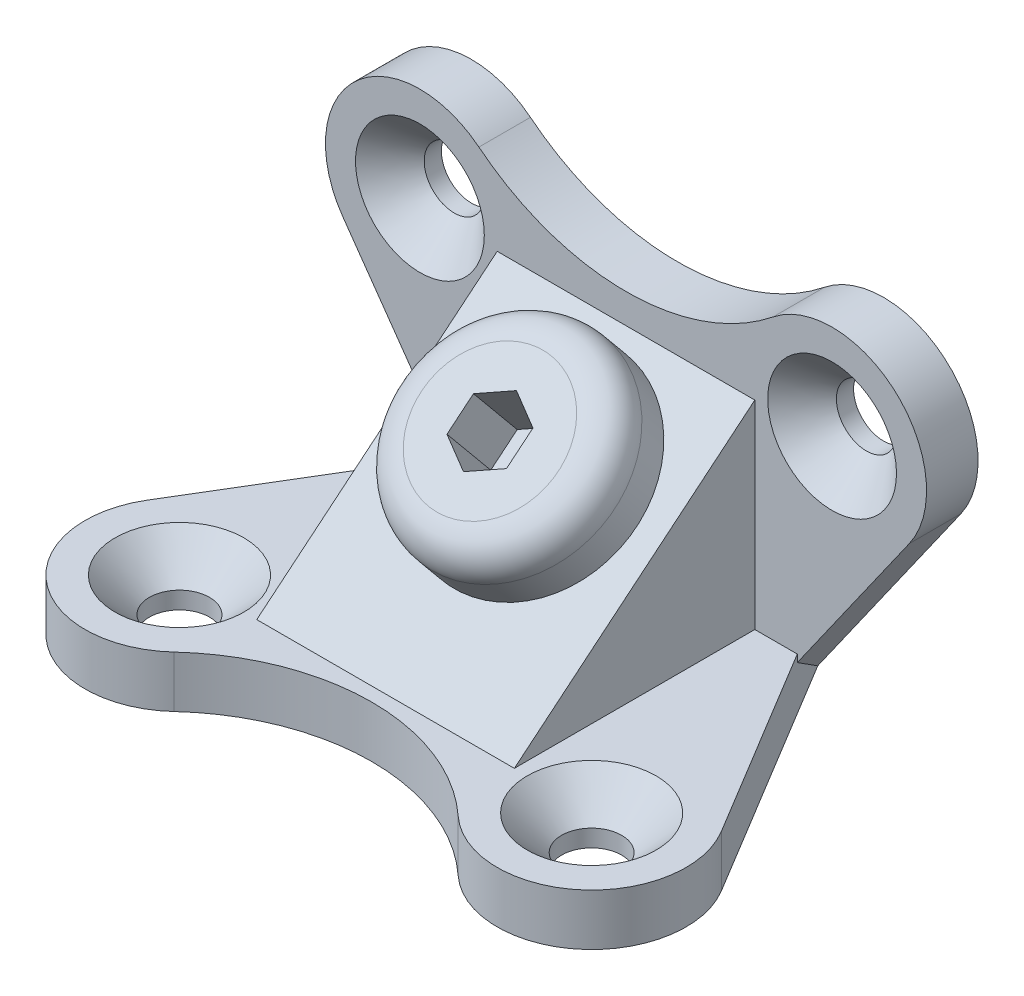
ISO-10303-21;
HEADER;
FILE_DESCRIPTION(('STEP AP214'),'2;1');
FILE_NAME('part.step','',(''),(''),'','','');
FILE_SCHEMA(('AUTOMOTIVE_DESIGN { 1 0 10303 214 1 1 1 1 }'));
ENDSEC;
DATA;
#1=APPLICATION_CONTEXT('core data for automotive mechanical design processes');
#2=APPLICATION_PROTOCOL_DEFINITION('international standard','automotive_design',2000,#1);
#3=PRODUCT_CONTEXT('',#1,'mechanical');
#4=PRODUCT('Part','Part','',(#3));
#5=PRODUCT_RELATED_PRODUCT_CATEGORY('part','',(#4));
#6=PRODUCT_DEFINITION_FORMATION('','',#4);
#7=PRODUCT_DEFINITION_CONTEXT('part definition',#1,'design');
#8=PRODUCT_DEFINITION('design','',#6,#7);
#9=PRODUCT_DEFINITION_SHAPE('','',#8);
#10=(LENGTH_UNIT() NAMED_UNIT(*) SI_UNIT(.MILLI.,.METRE.));
#11=(NAMED_UNIT(*) PLANE_ANGLE_UNIT() SI_UNIT($,.RADIAN.));
#12=(NAMED_UNIT(*) SI_UNIT($,.STERADIAN.) SOLID_ANGLE_UNIT());
#13=UNCERTAINTY_MEASURE_WITH_UNIT(LENGTH_MEASURE(1.E-05),#10,'distance_accuracy_value','');
#14=(GEOMETRIC_REPRESENTATION_CONTEXT(3) GLOBAL_UNCERTAINTY_ASSIGNED_CONTEXT((#13)) GLOBAL_UNIT_ASSIGNED_CONTEXT((#10,
#11,#12)) REPRESENTATION_CONTEXT('',''));
#15=CARTESIAN_POINT('',(0.,0.,0.));
#16=DIRECTION('',(0.,0.,1.));
#17=DIRECTION('',(1.,0.,0.));
#18=AXIS2_PLACEMENT_3D('',#15,#16,#17);
#19=CARTESIAN_POINT('',(7.5,3.,17.));
#20=DIRECTION('',(0.,-0.770800725640888,-0.637076323019056));
#21=DIRECTION('',(0.,0.637076323019056,-0.770800725640888));
#22=AXIS2_PLACEMENT_3D('',#19,#20,#21);
#23=PLANE('',#22);
#24=DIRECTION('',(0.,-0.637076323019056,0.770800725640888));
#25=VECTOR('',#24,1.);
#26=CARTESIAN_POINT('',(-7.5,3.,17.));
#27=LINE('',#26,#25);
#28=CARTESIAN_POINT('',(-7.5,14.5711729706157,3.));
#29=VERTEX_POINT('',#28);
#30=CARTESIAN_POINT('',(-7.5,3.,17.));
#31=VERTEX_POINT('',#30);
#32=EDGE_CURVE('E241',#29,#31,#27,.T.);
#33=ORIENTED_EDGE('',*,*,#32,.T.);
#34=DIRECTION('',(-1.,0.,0.));
#35=VECTOR('',#34,1.);
#36=CARTESIAN_POINT('',(7.5,3.,17.));
#37=LINE('',#36,#35);
#38=CARTESIAN_POINT('',(7.5,3.,17.));
#39=VERTEX_POINT('',#38);
#40=EDGE_CURVE('E239',#39,#31,#37,.T.);
#41=ORIENTED_EDGE('',*,*,#40,.F.);
#42=DIRECTION('',(0.,-0.637076323019056,0.770800725640888));
#43=VECTOR('',#42,1.);
#44=CARTESIAN_POINT('',(7.5,3.,17.));
#45=LINE('',#44,#43);
#46=CARTESIAN_POINT('',(7.5,14.5711729706157,3.));
#47=VERTEX_POINT('',#46);
#48=EDGE_CURVE('E234',#47,#39,#45,.T.);
#49=ORIENTED_EDGE('',*,*,#48,.F.);
#50=DIRECTION('',(-1.,0.,0.));
#51=VECTOR('',#50,1.);
#52=CARTESIAN_POINT('',(7.5,14.5711729706157,3.));
#53=LINE('',#52,#51);
#54=EDGE_CURVE('E246',#47,#29,#53,.T.);
#55=ORIENTED_EDGE('',*,*,#54,.T.);
#56=EDGE_LOOP('',(#33,#41,#49,#55));
#57=FACE_BOUND('',#56,.T.);
#58=CARTESIAN_POINT('',(0.,10.1304024411647,8.37290277919033));
#59=DIRECTION('',(0.,-0.770800725640888,-0.637076323019056));
#60=DIRECTION('',(0.,0.637076323019056,-0.770800725640888));
#61=AXIS2_PLACEMENT_3D('',#58,#59,#60);
#62=CIRCLE('',#61,6.);
#63=CARTESIAN_POINT('',(0.,13.9528603792791,3.748098425345));
#64=VERTEX_POINT('',#63);
#65=EDGE_CURVE('E350',#64,#64,#62,.F.);
#66=ORIENTED_EDGE('',*,*,#65,.F.);
#67=EDGE_LOOP('',(#66));
#68=FACE_BOUND('',#67,.T.);
#69=ADVANCED_FACE('F37',(#57,#68),#23,.F.);
#70=CARTESIAN_POINT('',(-12.,15.,3.));
#71=DIRECTION('',(0.,0.,1.));
#72=DIRECTION('',(1.,0.,0.));
#73=AXIS2_PLACEMENT_3D('',#70,#71,#72);
#74=PLANE('',#73);
#75=CARTESIAN_POINT('',(12.,15.,3.));
#76=DIRECTION('',(0.,0.,1.));
#77=DIRECTION('',(1.,0.,0.));
#78=AXIS2_PLACEMENT_3D('',#75,#76,#77);
#79=CIRCLE('',#78,3.75000000000001);
#80=CARTESIAN_POINT('',(15.75,15.,3.));
#81=VERTEX_POINT('',#80);
#82=EDGE_CURVE('E46',#81,#81,#79,.F.);
#83=ORIENTED_EDGE('',*,*,#82,.T.);
#84=EDGE_LOOP('',(#83));
#85=FACE_BOUND('',#84,.T.);
#86=CARTESIAN_POINT('',(-12.,15.,3.));
#87=DIRECTION('',(0.,0.,1.));
#88=DIRECTION('',(1.,0.,0.));
#89=AXIS2_PLACEMENT_3D('',#86,#87,#88);
#90=CIRCLE('',#89,3.75000000000001);
#91=CARTESIAN_POINT('',(-8.24999999999999,15.,3.));
#92=VERTEX_POINT('',#91);
#93=EDGE_CURVE('E374',#92,#92,#90,.F.);
#94=ORIENTED_EDGE('',*,*,#93,.T.);
#95=EDGE_LOOP('',(#94));
#96=FACE_BOUND('',#95,.T.);
#97=ORIENTED_EDGE('',*,*,#54,.F.);
#98=DIRECTION('',(0.,1.,0.));
#99=VECTOR('',#98,1.);
#100=CARTESIAN_POINT('',(7.5,14.5711729706157,3.));
#101=LINE('',#100,#99);
#102=CARTESIAN_POINT('',(7.5,3.,3.));
#103=VERTEX_POINT('',#102);
#104=EDGE_CURVE('E231',#103,#47,#101,.T.);
#105=ORIENTED_EDGE('',*,*,#104,.F.);
#106=DIRECTION('',(1.,0.,0.));
#107=VECTOR('',#106,1.);
#108=CARTESIAN_POINT('',(-12.,3.,3.));
#109=LINE('',#108,#107);
#110=CARTESIAN_POINT('',(9.97367460158674,3.,3.));
#111=VERTEX_POINT('',#110);
#112=EDGE_CURVE('E298',#103,#111,#109,.T.);
#113=ORIENTED_EDGE('',*,*,#112,.T.);
#114=DIRECTION('',(0.,1.,0.));
#115=VECTOR('',#114,1.);
#116=CARTESIAN_POINT('',(9.97367460158674,15.,3.));
#117=LINE('',#116,#115);
#118=CARTESIAN_POINT('',(9.97367460158674,2.57117297061568,3.));
#119=VERTEX_POINT('',#118);
#120=EDGE_CURVE('E287',#119,#111,#117,.T.);
#121=ORIENTED_EDGE('',*,*,#120,.F.);
#122=DIRECTION('',(0.575813420874056,0.817581130127963,0.));
#123=VECTOR('',#122,1.);
#124=CARTESIAN_POINT('',(8.16282568481025,0.,3.));
#125=LINE('',#124,#123);
#126=CARTESIAN_POINT('',(16.4966962157038,11.8330261851927,3.));
#127=VERTEX_POINT('',#126);
#128=EDGE_CURVE('E312',#119,#127,#125,.T.);
#129=ORIENTED_EDGE('',*,*,#128,.T.);
#130=CARTESIAN_POINT('',(12.,15.,3.));
#131=DIRECTION('',(0.,0.,1.));
#132=DIRECTION('',(-1.,0.,0.));
#133=AXIS2_PLACEMENT_3D('',#130,#131,#132);
#134=CIRCLE('',#133,5.5);
#135=CARTESIAN_POINT('',(8.56417723845067,19.2947784519367,3.));
#136=VERTEX_POINT('',#135);
#137=EDGE_CURVE('E315',#127,#136,#134,.T.);
#138=ORIENTED_EDGE('',*,*,#137,.T.);
#139=CARTESIAN_POINT('',(0.,30.,3.));
#140=DIRECTION('',(0.,0.,-1.));
#141=DIRECTION('',(1.,0.,0.));
#142=AXIS2_PLACEMENT_3D('',#139,#140,#141);
#143=CIRCLE('',#142,13.7093727122985);
#144=CARTESIAN_POINT('',(-8.56417723845066,19.2947784519367,3.));
#145=VERTEX_POINT('',#144);
#146=EDGE_CURVE('E317',#136,#145,#143,.T.);
#147=ORIENTED_EDGE('',*,*,#146,.T.);
#148=CARTESIAN_POINT('',(-12.,15.,3.));
#149=DIRECTION('',(0.,0.,1.));
#150=DIRECTION('',(1.,0.,0.));
#151=AXIS2_PLACEMENT_3D('',#148,#149,#150);
#152=CIRCLE('',#151,5.5);
#153=CARTESIAN_POINT('',(-16.4966962157038,11.8330261851927,3.));
#154=VERTEX_POINT('',#153);
#155=EDGE_CURVE('E319',#145,#154,#152,.T.);
#156=ORIENTED_EDGE('',*,*,#155,.T.);
#157=DIRECTION('',(0.575813420874056,-0.817581130127963,0.));
#158=VECTOR('',#157,1.);
#159=CARTESIAN_POINT('',(-8.16282568481025,0.,3.));
#160=LINE('',#159,#158);
#161=CARTESIAN_POINT('',(-9.97367460158674,2.57117297061568,3.));
#162=VERTEX_POINT('',#161);
#163=EDGE_CURVE('E309',#154,#162,#160,.T.);
#164=ORIENTED_EDGE('',*,*,#163,.T.);
#165=DIRECTION('',(0.,-1.,0.));
#166=VECTOR('',#165,1.);
#167=CARTESIAN_POINT('',(-9.97367460158674,15.,3.));
#168=LINE('',#167,#166);
#169=CARTESIAN_POINT('',(-9.97367460158674,3.,3.));
#170=VERTEX_POINT('',#169);
#171=EDGE_CURVE('E295',#170,#162,#168,.T.);
#172=ORIENTED_EDGE('',*,*,#171,.F.);
#173=CARTESIAN_POINT('',(-7.5,3.,3.));
#174=VERTEX_POINT('',#173);
#175=EDGE_CURVE('E299',#170,#174,#109,.T.);
#176=ORIENTED_EDGE('',*,*,#175,.T.);
#177=DIRECTION('',(0.,1.,0.));
#178=VECTOR('',#177,1.);
#179=CARTESIAN_POINT('',(-7.5,14.5711729706157,3.));
#180=LINE('',#179,#178);
#181=EDGE_CURVE('E61',#174,#29,#180,.T.);
#182=ORIENTED_EDGE('',*,*,#181,.T.);
#183=EDGE_LOOP('',(#97,#105,#113,#121,#129,#138,#147,#156,#164,#172,#176,#182));
#184=FACE_BOUND('',#183,.T.);
#185=ADVANCED_FACE('F379',(#85,#96,#184),#74,.T.);
#186=CARTESIAN_POINT('',(0.,3.,30.));
#187=DIRECTION('',(0.,-1.,0.));
#188=DIRECTION('',(0.,0.,-1.));
#189=AXIS2_PLACEMENT_3D('',#186,#187,#188);
#190=PLANE('',#189);
#191=CARTESIAN_POINT('',(-12.,3.,17.));
#192=DIRECTION('',(0.,-1.,0.));
#193=DIRECTION('',(0.,0.,-1.));
#194=AXIS2_PLACEMENT_3D('',#191,#192,#193);
#195=CIRCLE('',#194,3.75);
#196=CARTESIAN_POINT('',(-12.,3.,13.25));
#197=VERTEX_POINT('',#196);
#198=EDGE_CURVE('E362',#197,#197,#195,.T.);
#199=ORIENTED_EDGE('',*,*,#198,.T.);
#200=EDGE_LOOP('',(#199));
#201=FACE_BOUND('',#200,.T.);
#202=CARTESIAN_POINT('',(12.,3.,17.));
#203=DIRECTION('',(0.,-1.,0.));
#204=DIRECTION('',(0.,0.,-1.));
#205=AXIS2_PLACEMENT_3D('',#202,#203,#204);
#206=CIRCLE('',#205,3.74999999999999);
#207=CARTESIAN_POINT('',(12.,3.,13.25));
#208=VERTEX_POINT('',#207);
#209=EDGE_CURVE('E359',#208,#208,#206,.T.);
#210=ORIENTED_EDGE('',*,*,#209,.T.);
#211=EDGE_LOOP('',(#210));
#212=FACE_BOUND('',#211,.T.);
#213=DIRECTION('',(0.,0.,-1.));
#214=VECTOR('',#213,1.);
#215=CARTESIAN_POINT('',(7.5,3.,3.));
#216=LINE('',#215,#214);
#217=EDGE_CURVE('E237',#39,#103,#216,.T.);
#218=ORIENTED_EDGE('',*,*,#217,.F.);
#219=ORIENTED_EDGE('',*,*,#40,.T.);
#220=DIRECTION('',(0.,0.,-1.));
#221=VECTOR('',#220,1.);
#222=CARTESIAN_POINT('',(-7.5,3.,3.));
#223=LINE('',#222,#221);
#224=EDGE_CURVE('E235',#31,#174,#223,.T.);
#225=ORIENTED_EDGE('',*,*,#224,.T.);
#226=ORIENTED_EDGE('',*,*,#175,.F.);
#227=DIRECTION('',(0.516770417402931,0.,-0.856124018876471));
#228=VECTOR('',#227,1.);
#229=CARTESIAN_POINT('',(-8.16282568481025,3.,0.));
#230=LINE('',#229,#228);
#231=CARTESIAN_POINT('',(-16.7086821038206,3.,14.1577627042839));
#232=VERTEX_POINT('',#231);
#233=EDGE_CURVE('E263',#232,#170,#230,.T.);
#234=ORIENTED_EDGE('',*,*,#233,.F.);
#235=CARTESIAN_POINT('',(-12.,3.,17.));
#236=DIRECTION('',(0.,-1.,0.));
#237=DIRECTION('',(0.,0.,-1.));
#238=AXIS2_PLACEMENT_3D('',#235,#236,#237);
#239=CIRCLE('',#238,5.5);
#240=CARTESIAN_POINT('',(-8.26945943496814,3.,21.0414189454512));
#241=VERTEX_POINT('',#240);
#242=EDGE_CURVE('E259',#241,#232,#239,.T.);
#243=ORIENTED_EDGE('',*,*,#242,.F.);
#244=CARTESIAN_POINT('',(0.,3.,30.));
#245=DIRECTION('',(0.,1.,0.));
#246=DIRECTION('',(0.,0.,-1.));
#247=AXIS2_PLACEMENT_3D('',#244,#245,#246);
#248=CIRCLE('',#247,12.1918060129541);
#249=CARTESIAN_POINT('',(8.26945943496814,3.,21.0414189454512));
#250=VERTEX_POINT('',#249);
#251=EDGE_CURVE('E256',#250,#241,#248,.T.);
#252=ORIENTED_EDGE('',*,*,#251,.F.);
#253=CARTESIAN_POINT('',(12.,3.,17.));
#254=DIRECTION('',(0.,-1.,0.));
#255=DIRECTION('',(0.,0.,1.));
#256=AXIS2_PLACEMENT_3D('',#253,#254,#255);
#257=CIRCLE('',#256,5.5);
#258=CARTESIAN_POINT('',(16.7086821038206,3.,14.1577627042839));
#259=VERTEX_POINT('',#258);
#260=EDGE_CURVE('E268',#259,#250,#257,.T.);
#261=ORIENTED_EDGE('',*,*,#260,.F.);
#262=DIRECTION('',(0.516770417402931,0.,0.856124018876471));
#263=VECTOR('',#262,1.);
#264=CARTESIAN_POINT('',(8.16282568481025,3.,0.));
#265=LINE('',#264,#263);
#266=EDGE_CURVE('E266',#111,#259,#265,.T.);
#267=ORIENTED_EDGE('',*,*,#266,.F.);
#268=ORIENTED_EDGE('',*,*,#112,.F.);
#269=EDGE_LOOP('',(#218,#219,#225,#226,#234,#243,#252,#261,#267,#268));
#270=FACE_BOUND('',#269,.T.);
#271=ADVANCED_FACE('F399',(#201,#212,#270),#190,.F.);
#272=CARTESIAN_POINT('',(-12.,15.,0.));
#273=DIRECTION('',(0.,0.,1.));
#274=DIRECTION('',(1.,0.,0.));
#275=AXIS2_PLACEMENT_3D('',#272,#273,#274);
#276=PLANE('',#275);
#277=DIRECTION('',(1.,0.,0.));
#278=VECTOR('',#277,1.);
#279=CARTESIAN_POINT('',(8.16282568481025,0.,0.));
#280=LINE('',#279,#278);
#281=CARTESIAN_POINT('',(-8.16282568481025,0.,0.));
#282=VERTEX_POINT('',#281);
#283=CARTESIAN_POINT('',(8.16282568481025,0.,0.));
#284=VERTEX_POINT('',#283);
#285=EDGE_CURVE('E324',#282,#284,#280,.T.);
#286=ORIENTED_EDGE('',*,*,#285,.F.);
#287=DIRECTION('',(0.575813420874056,-0.817581130127963,0.));
#288=VECTOR('',#287,1.);
#289=CARTESIAN_POINT('',(-8.16282568481025,0.,0.));
#290=LINE('',#289,#288);
#291=CARTESIAN_POINT('',(-16.4966962157038,11.8330261851927,0.));
#292=VERTEX_POINT('',#291);
#293=EDGE_CURVE('E308',#292,#282,#290,.T.);
#294=ORIENTED_EDGE('',*,*,#293,.F.);
#295=CARTESIAN_POINT('',(-12.,15.,0.));
#296=DIRECTION('',(0.,0.,1.));
#297=DIRECTION('',(1.,0.,0.));
#298=AXIS2_PLACEMENT_3D('',#295,#296,#297);
#299=CIRCLE('',#298,5.5);
#300=CARTESIAN_POINT('',(-8.56417723845066,19.2947784519367,0.));
#301=VERTEX_POINT('',#300);
#302=EDGE_CURVE('E313',#301,#292,#299,.T.);
#303=ORIENTED_EDGE('',*,*,#302,.F.);
#304=CARTESIAN_POINT('',(0.,30.,0.));
#305=DIRECTION('',(0.,0.,-1.));
#306=DIRECTION('',(1.,0.,0.));
#307=AXIS2_PLACEMENT_3D('',#304,#305,#306);
#308=CIRCLE('',#307,13.7093727122985);
#309=CARTESIAN_POINT('',(8.56417723845067,19.2947784519367,0.));
#310=VERTEX_POINT('',#309);
#311=EDGE_CURVE('E331',#310,#301,#308,.T.);
#312=ORIENTED_EDGE('',*,*,#311,.F.);
#313=CARTESIAN_POINT('',(12.,15.,0.));
#314=DIRECTION('',(0.,0.,1.));
#315=DIRECTION('',(-1.,0.,0.));
#316=AXIS2_PLACEMENT_3D('',#313,#314,#315);
#317=CIRCLE('',#316,5.5);
#318=CARTESIAN_POINT('',(16.4966962157038,11.8330261851927,0.));
#319=VERTEX_POINT('',#318);
#320=EDGE_CURVE('E329',#319,#310,#317,.T.);
#321=ORIENTED_EDGE('',*,*,#320,.F.);
#322=DIRECTION('',(0.575813420874056,0.817581130127963,0.));
#323=VECTOR('',#322,1.);
#324=CARTESIAN_POINT('',(8.16282568481025,0.,0.));
#325=LINE('',#324,#323);
#326=EDGE_CURVE('E327',#284,#319,#325,.T.);
#327=ORIENTED_EDGE('',*,*,#326,.F.);
#328=EDGE_LOOP('',(#286,#294,#303,#312,#321,#327));
#329=FACE_BOUND('',#328,.T.);
#330=CARTESIAN_POINT('',(-12.,15.,0.));
#331=DIRECTION('',(0.,0.,1.));
#332=DIRECTION('',(1.,0.,0.));
#333=AXIS2_PLACEMENT_3D('',#330,#331,#332);
#334=CIRCLE('',#333,1.75);
#335=CARTESIAN_POINT('',(-10.25,15.,0.));
#336=VERTEX_POINT('',#335);
#337=EDGE_CURVE('E305',#336,#336,#334,.T.);
#338=ORIENTED_EDGE('',*,*,#337,.T.);
#339=EDGE_LOOP('',(#338));
#340=FACE_BOUND('',#339,.T.);
#341=CARTESIAN_POINT('',(12.,15.,0.));
#342=DIRECTION('',(0.,0.,1.));
#343=DIRECTION('',(-1.,0.,0.));
#344=AXIS2_PLACEMENT_3D('',#341,#342,#343);
#345=CIRCLE('',#344,1.75);
#346=CARTESIAN_POINT('',(10.25,15.,0.));
#347=VERTEX_POINT('',#346);
#348=EDGE_CURVE('E302',#347,#347,#345,.T.);
#349=ORIENTED_EDGE('',*,*,#348,.T.);
#350=EDGE_LOOP('',(#349));
#351=FACE_BOUND('',#350,.T.);
#352=ADVANCED_FACE('F396',(#329,#340,#351),#276,.F.);
#353=CARTESIAN_POINT('',(-8.16282568481025,0.,3.));
#354=DIRECTION('',(0.817581130127963,0.575813420874056,0.));
#355=DIRECTION('',(-0.575813420874056,0.817581130127964,0.));
#356=AXIS2_PLACEMENT_3D('',#353,#354,#355);
#357=PLANE('',#356);
#358=ORIENTED_EDGE('',*,*,#293,.T.);
#359=DIRECTION('',(-0.416643912071236,0.591580863077249,0.690246284288987));
#360=VECTOR('',#359,1.);
#361=CARTESIAN_POINT('',(-9.02558642134664,1.22500947778663,1.42931979892426));
#362=LINE('',#361,#360);
#363=EDGE_CURVE('E348',#282,#162,#362,.T.);
#364=ORIENTED_EDGE('',*,*,#363,.T.);
#365=ORIENTED_EDGE('',*,*,#163,.F.);
#366=DIRECTION('',(0.,0.,-1.));
#367=VECTOR('',#366,1.);
#368=CARTESIAN_POINT('',(-16.4966962157038,11.8330261851927,3.));
#369=LINE('',#368,#367);
#370=EDGE_CURVE('E321',#154,#292,#369,.T.);
#371=ORIENTED_EDGE('',*,*,#370,.T.);
#372=EDGE_LOOP('',(#358,#364,#365,#371));
#373=FACE_BOUND('',#372,.T.);
#374=ADVANCED_FACE('F398',(#373),#357,.F.);
#375=CARTESIAN_POINT('',(8.16282568481025,0.,3.));
#376=DIRECTION('',(0.,1.,0.));
#377=DIRECTION('',(0.,0.,1.));
#378=AXIS2_PLACEMENT_3D('',#375,#376,#377);
#379=PLANE('',#378);
#380=DIRECTION('',(0.516770417402931,0.,-0.856124018876471));
#381=VECTOR('',#380,1.);
#382=CARTESIAN_POINT('',(-8.16282568481025,0.,0.));
#383=LINE('',#382,#381);
#384=CARTESIAN_POINT('',(-16.7086821038206,0.,14.1577627042839));
#385=VERTEX_POINT('',#384);
#386=EDGE_CURVE('E277',#385,#282,#383,.T.);
#387=ORIENTED_EDGE('',*,*,#386,.T.);
#388=ORIENTED_EDGE('',*,*,#285,.T.);
#389=DIRECTION('',(0.516770417402931,0.,0.856124018876471));
#390=VECTOR('',#389,1.);
#391=CARTESIAN_POINT('',(8.16282568481025,0.,0.));
#392=LINE('',#391,#390);
#393=CARTESIAN_POINT('',(16.7086821038206,0.,14.1577627042839));
#394=VERTEX_POINT('',#393);
#395=EDGE_CURVE('E280',#284,#394,#392,.T.);
#396=ORIENTED_EDGE('',*,*,#395,.T.);
#397=CARTESIAN_POINT('',(12.,0.,17.));
#398=DIRECTION('',(0.,-1.,0.));
#399=DIRECTION('',(0.,0.,1.));
#400=AXIS2_PLACEMENT_3D('',#397,#398,#399);
#401=CIRCLE('',#400,5.5);
#402=CARTESIAN_POINT('',(8.26945943496814,0.,21.0414189454512));
#403=VERTEX_POINT('',#402);
#404=EDGE_CURVE('E260',#394,#403,#401,.T.);
#405=ORIENTED_EDGE('',*,*,#404,.T.);
#406=CARTESIAN_POINT('',(0.,0.,30.));
#407=DIRECTION('',(0.,1.,0.));
#408=DIRECTION('',(0.,0.,-1.));
#409=AXIS2_PLACEMENT_3D('',#406,#407,#408);
#410=CIRCLE('',#409,12.1918060129541);
#411=CARTESIAN_POINT('',(-8.26945943496814,0.,21.0414189454512));
#412=VERTEX_POINT('',#411);
#413=EDGE_CURVE('E255',#403,#412,#410,.T.);
#414=ORIENTED_EDGE('',*,*,#413,.T.);
#415=CARTESIAN_POINT('',(-12.,0.,17.));
#416=DIRECTION('',(0.,-1.,0.));
#417=DIRECTION('',(0.,0.,-1.));
#418=AXIS2_PLACEMENT_3D('',#415,#416,#417);
#419=CIRCLE('',#418,5.5);
#420=EDGE_CURVE('E274',#412,#385,#419,.T.);
#421=ORIENTED_EDGE('',*,*,#420,.T.);
#422=EDGE_LOOP('',(#387,#388,#396,#405,#414,#421));
#423=FACE_BOUND('',#422,.T.);
#424=CARTESIAN_POINT('',(-12.,0.,17.));
#425=DIRECTION('',(0.,-1.,0.));
#426=DIRECTION('',(0.,0.,-1.));
#427=AXIS2_PLACEMENT_3D('',#424,#425,#426);
#428=CIRCLE('',#427,1.75);
#429=CARTESIAN_POINT('',(-12.,0.,15.25));
#430=VERTEX_POINT('',#429);
#431=EDGE_CURVE('E252',#430,#430,#428,.T.);
#432=ORIENTED_EDGE('',*,*,#431,.F.);
#433=EDGE_LOOP('',(#432));
#434=FACE_BOUND('',#433,.T.);
#435=CARTESIAN_POINT('',(12.,0.,17.));
#436=DIRECTION('',(0.,-1.,0.));
#437=DIRECTION('',(0.,0.,1.));
#438=AXIS2_PLACEMENT_3D('',#435,#436,#437);
#439=CIRCLE('',#438,1.75);
#440=CARTESIAN_POINT('',(12.,0.,18.75));
#441=VERTEX_POINT('',#440);
#442=EDGE_CURVE('E249',#441,#441,#439,.T.);
#443=ORIENTED_EDGE('',*,*,#442,.F.);
#444=EDGE_LOOP('',(#443));
#445=FACE_BOUND('',#444,.T.);
#446=ADVANCED_FACE('F406',(#423,#434,#445),#379,.F.);
#447=CARTESIAN_POINT('',(8.16282568481025,0.,3.));
#448=DIRECTION('',(-0.817581130127963,0.575813420874056,0.));
#449=DIRECTION('',(-0.575813420874056,-0.817581130127964,0.));
#450=AXIS2_PLACEMENT_3D('',#447,#448,#449);
#451=PLANE('',#450);
#452=ORIENTED_EDGE('',*,*,#128,.F.);
#453=DIRECTION('',(-0.416643912071236,-0.591580863077249,-0.690246284288987));
#454=VECTOR('',#453,1.);
#455=CARTESIAN_POINT('',(9.02558642134664,1.22500947778663,1.42931979892426));
#456=LINE('',#455,#454);
#457=EDGE_CURVE('E345',#119,#284,#456,.T.);
#458=ORIENTED_EDGE('',*,*,#457,.T.);
#459=ORIENTED_EDGE('',*,*,#326,.T.);
#460=DIRECTION('',(0.,0.,-1.));
#461=VECTOR('',#460,1.);
#462=CARTESIAN_POINT('',(16.4966962157038,11.8330261851927,3.));
#463=LINE('',#462,#461);
#464=EDGE_CURVE('E342',#127,#319,#463,.T.);
#465=ORIENTED_EDGE('',*,*,#464,.F.);
#466=EDGE_LOOP('',(#452,#458,#459,#465));
#467=FACE_BOUND('',#466,.T.);
#468=ADVANCED_FACE('F602',(#467),#451,.F.);
#469=CARTESIAN_POINT('',(12.,15.,3.));
#470=DIRECTION('',(0.,0.,-1.));
#471=DIRECTION('',(-1.,0.,0.));
#472=AXIS2_PLACEMENT_3D('',#469,#470,#471);
#473=CYLINDRICAL_SURFACE('',#472,5.5);
#474=ORIENTED_EDGE('',*,*,#320,.T.);
#475=DIRECTION('',(0.,0.,-1.));
#476=VECTOR('',#475,1.);
#477=CARTESIAN_POINT('',(8.56417723845067,19.2947784519367,3.));
#478=LINE('',#477,#476);
#479=EDGE_CURVE('E339',#136,#310,#478,.T.);
#480=ORIENTED_EDGE('',*,*,#479,.F.);
#481=ORIENTED_EDGE('',*,*,#137,.F.);
#482=ORIENTED_EDGE('',*,*,#464,.T.);
#483=EDGE_LOOP('',(#474,#480,#481,#482));
#484=FACE_BOUND('',#483,.T.);
#485=ADVANCED_FACE('F607',(#484),#473,.T.);
#486=CARTESIAN_POINT('',(0.,30.,3.));
#487=DIRECTION('',(0.,0.,-1.));
#488=DIRECTION('',(-1.,0.,0.));
#489=AXIS2_PLACEMENT_3D('',#486,#487,#488);
#490=CYLINDRICAL_SURFACE('',#489,13.7093727122985);
#491=ORIENTED_EDGE('',*,*,#311,.T.);
#492=DIRECTION('',(0.,0.,-1.));
#493=VECTOR('',#492,1.);
#494=CARTESIAN_POINT('',(-8.56417723845066,19.2947784519367,3.));
#495=LINE('',#494,#493);
#496=EDGE_CURVE('E336',#145,#301,#495,.T.);
#497=ORIENTED_EDGE('',*,*,#496,.F.);
#498=ORIENTED_EDGE('',*,*,#146,.F.);
#499=ORIENTED_EDGE('',*,*,#479,.T.);
#500=EDGE_LOOP('',(#491,#497,#498,#499));
#501=FACE_BOUND('',#500,.T.);
#502=ADVANCED_FACE('F640',(#501),#490,.F.);
#503=CARTESIAN_POINT('',(-12.,15.,3.));
#504=DIRECTION('',(0.,0.,-1.));
#505=DIRECTION('',(-1.,0.,0.));
#506=AXIS2_PLACEMENT_3D('',#503,#504,#505);
#507=CYLINDRICAL_SURFACE('',#506,5.5);
#508=ORIENTED_EDGE('',*,*,#302,.T.);
#509=ORIENTED_EDGE('',*,*,#370,.F.);
#510=ORIENTED_EDGE('',*,*,#155,.F.);
#511=ORIENTED_EDGE('',*,*,#496,.T.);
#512=EDGE_LOOP('',(#508,#509,#510,#511));
#513=FACE_BOUND('',#512,.T.);
#514=ADVANCED_FACE('F635',(#513),#507,.T.);
#515=CARTESIAN_POINT('',(-12.,15.,3.));
#516=DIRECTION('',(0.,0.,-1.));
#517=DIRECTION('',(-1.,0.,0.));
#518=AXIS2_PLACEMENT_3D('',#515,#516,#517);
#519=CYLINDRICAL_SURFACE('',#518,1.75);
#520=CARTESIAN_POINT('',(-12.,15.,0.999999999999997));
#521=DIRECTION('',(0.,0.,1.));
#522=DIRECTION('',(1.,0.,0.));
#523=AXIS2_PLACEMENT_3D('',#520,#521,#522);
#524=CIRCLE('',#523,1.75);
#525=CARTESIAN_POINT('',(-10.25,15.,0.999999999999997));
#526=VERTEX_POINT('',#525);
#527=EDGE_CURVE('E11',#526,#526,#524,.T.);
#528=ORIENTED_EDGE('',*,*,#527,.T.);
#529=EDGE_LOOP('',(#528));
#530=FACE_BOUND('',#529,.T.);
#531=ORIENTED_EDGE('',*,*,#337,.F.);
#532=EDGE_LOOP('',(#531));
#533=FACE_BOUND('',#532,.T.);
#534=ADVANCED_FACE('F392',(#530,#533),#519,.F.);
#535=CARTESIAN_POINT('',(12.,15.,3.));
#536=DIRECTION('',(0.,0.,-1.));
#537=DIRECTION('',(-1.,0.,0.));
#538=AXIS2_PLACEMENT_3D('',#535,#536,#537);
#539=CYLINDRICAL_SURFACE('',#538,1.75);
#540=CARTESIAN_POINT('',(12.,15.,0.999999999999997));
#541=DIRECTION('',(0.,0.,1.));
#542=DIRECTION('',(1.,0.,0.));
#543=AXIS2_PLACEMENT_3D('',#540,#541,#542);
#544=CIRCLE('',#543,1.75);
#545=CARTESIAN_POINT('',(13.75,15.,0.999999999999997));
#546=VERTEX_POINT('',#545);
#547=EDGE_CURVE('E371',#546,#546,#544,.T.);
#548=ORIENTED_EDGE('',*,*,#547,.T.);
#549=EDGE_LOOP('',(#548));
#550=FACE_BOUND('',#549,.T.);
#551=ORIENTED_EDGE('',*,*,#348,.F.);
#552=EDGE_LOOP('',(#551));
#553=FACE_BOUND('',#552,.T.);
#554=ADVANCED_FACE('F388',(#550,#553),#539,.F.);
#555=CARTESIAN_POINT('',(0.,3.,30.));
#556=DIRECTION('',(0.,-1.,0.));
#557=DIRECTION('',(0.,0.,-1.));
#558=AXIS2_PLACEMENT_3D('',#555,#556,#557);
#559=CYLINDRICAL_SURFACE('',#558,12.1918060129541);
#560=ORIENTED_EDGE('',*,*,#413,.F.);
#561=DIRECTION('',(0.,-1.,0.));
#562=VECTOR('',#561,1.);
#563=CARTESIAN_POINT('',(8.26945943496814,3.,21.0414189454512));
#564=LINE('',#563,#562);
#565=EDGE_CURVE('E285',#250,#403,#564,.T.);
#566=ORIENTED_EDGE('',*,*,#565,.F.);
#567=ORIENTED_EDGE('',*,*,#251,.T.);
#568=DIRECTION('',(0.,-1.,0.));
#569=VECTOR('',#568,1.);
#570=CARTESIAN_POINT('',(-8.26945943496814,3.,21.0414189454512));
#571=LINE('',#570,#569);
#572=EDGE_CURVE('E271',#241,#412,#571,.T.);
#573=ORIENTED_EDGE('',*,*,#572,.T.);
#574=EDGE_LOOP('',(#560,#566,#567,#573));
#575=FACE_BOUND('',#574,.T.);
#576=ADVANCED_FACE('F391',(#575),#559,.F.);
#577=CARTESIAN_POINT('',(12.,3.,17.));
#578=DIRECTION('',(0.,-1.,0.));
#579=DIRECTION('',(0.,0.,-1.));
#580=AXIS2_PLACEMENT_3D('',#577,#578,#579);
#581=CYLINDRICAL_SURFACE('',#580,5.5);
#582=ORIENTED_EDGE('',*,*,#404,.F.);
#583=DIRECTION('',(0.,-1.,0.));
#584=VECTOR('',#583,1.);
#585=CARTESIAN_POINT('',(16.7086821038206,3.,14.1577627042839));
#586=LINE('',#585,#584);
#587=EDGE_CURVE('E288',#259,#394,#586,.T.);
#588=ORIENTED_EDGE('',*,*,#587,.F.);
#589=ORIENTED_EDGE('',*,*,#260,.T.);
#590=ORIENTED_EDGE('',*,*,#565,.T.);
#591=EDGE_LOOP('',(#582,#588,#589,#590));
#592=FACE_BOUND('',#591,.T.);
#593=ADVANCED_FACE('F577',(#592),#581,.T.);
#594=CARTESIAN_POINT('',(8.16282568481025,3.,0.));
#595=DIRECTION('',(0.856124018876471,0.,-0.516770417402931));
#596=DIRECTION('',(-0.516770417402931,0.,-0.856124018876471));
#597=AXIS2_PLACEMENT_3D('',#594,#595,#596);
#598=PLANE('',#597);
#599=ORIENTED_EDGE('',*,*,#457,.F.);
#600=ORIENTED_EDGE('',*,*,#120,.T.);
#601=ORIENTED_EDGE('',*,*,#266,.T.);
#602=ORIENTED_EDGE('',*,*,#587,.T.);
#603=ORIENTED_EDGE('',*,*,#395,.F.);
#604=EDGE_LOOP('',(#599,#600,#601,#602,#603));
#605=FACE_BOUND('',#604,.T.);
#606=ADVANCED_FACE('F567',(#605),#598,.T.);
#607=CARTESIAN_POINT('',(-8.16282568481025,3.,0.));
#608=DIRECTION('',(-0.856124018876471,0.,-0.516770417402931));
#609=DIRECTION('',(-0.516770417402931,0.,0.856124018876471));
#610=AXIS2_PLACEMENT_3D('',#607,#608,#609);
#611=PLANE('',#610);
#612=ORIENTED_EDGE('',*,*,#233,.T.);
#613=ORIENTED_EDGE('',*,*,#171,.T.);
#614=ORIENTED_EDGE('',*,*,#363,.F.);
#615=ORIENTED_EDGE('',*,*,#386,.F.);
#616=DIRECTION('',(0.,-1.,0.));
#617=VECTOR('',#616,1.);
#618=CARTESIAN_POINT('',(-16.7086821038206,3.,14.1577627042839));
#619=LINE('',#618,#617);
#620=EDGE_CURVE('E290',#232,#385,#619,.T.);
#621=ORIENTED_EDGE('',*,*,#620,.F.);
#622=EDGE_LOOP('',(#612,#613,#614,#615,#621));
#623=FACE_BOUND('',#622,.T.);
#624=ADVANCED_FACE('F555',(#623),#611,.T.);
#625=CARTESIAN_POINT('',(-12.,3.,17.));
#626=DIRECTION('',(0.,-1.,0.));
#627=DIRECTION('',(0.,0.,-1.));
#628=AXIS2_PLACEMENT_3D('',#625,#626,#627);
#629=CYLINDRICAL_SURFACE('',#628,5.5);
#630=ORIENTED_EDGE('',*,*,#420,.F.);
#631=ORIENTED_EDGE('',*,*,#572,.F.);
#632=ORIENTED_EDGE('',*,*,#242,.T.);
#633=ORIENTED_EDGE('',*,*,#620,.T.);
#634=EDGE_LOOP('',(#630,#631,#632,#633));
#635=FACE_BOUND('',#634,.T.);
#636=ADVANCED_FACE('F549',(#635),#629,.T.);
#637=CARTESIAN_POINT('',(-12.,3.,17.));
#638=DIRECTION('',(0.,-1.,0.));
#639=DIRECTION('',(0.,0.,-1.));
#640=AXIS2_PLACEMENT_3D('',#637,#638,#639);
#641=CYLINDRICAL_SURFACE('',#640,1.75);
#642=CARTESIAN_POINT('',(-12.,0.999999999999986,17.));
#643=DIRECTION('',(0.,-1.,0.));
#644=DIRECTION('',(0.,0.,-1.));
#645=AXIS2_PLACEMENT_3D('',#642,#643,#644);
#646=CIRCLE('',#645,1.75);
#647=CARTESIAN_POINT('',(-12.,0.999999999999986,15.25));
#648=VERTEX_POINT('',#647);
#649=EDGE_CURVE('E365',#648,#648,#646,.F.);
#650=ORIENTED_EDGE('',*,*,#649,.T.);
#651=EDGE_LOOP('',(#650));
#652=FACE_BOUND('',#651,.T.);
#653=ORIENTED_EDGE('',*,*,#431,.T.);
#654=EDGE_LOOP('',(#653));
#655=FACE_BOUND('',#654,.T.);
#656=ADVANCED_FACE('F554',(#652,#655),#641,.F.);
#657=CARTESIAN_POINT('',(12.,3.,17.));
#658=DIRECTION('',(0.,-1.,0.));
#659=DIRECTION('',(0.,0.,-1.));
#660=AXIS2_PLACEMENT_3D('',#657,#658,#659);
#661=CYLINDRICAL_SURFACE('',#660,1.75);
#662=CARTESIAN_POINT('',(12.,0.999999999999997,17.));
#663=DIRECTION('',(0.,-1.,0.));
#664=DIRECTION('',(0.,0.,-1.));
#665=AXIS2_PLACEMENT_3D('',#662,#663,#664);
#666=CIRCLE('',#665,1.75);
#667=CARTESIAN_POINT('',(12.,0.999999999999997,15.25));
#668=VERTEX_POINT('',#667);
#669=EDGE_CURVE('E368',#668,#668,#666,.F.);
#670=ORIENTED_EDGE('',*,*,#669,.T.);
#671=EDGE_LOOP('',(#670));
#672=FACE_BOUND('',#671,.T.);
#673=ORIENTED_EDGE('',*,*,#442,.T.);
#674=EDGE_LOOP('',(#673));
#675=FACE_BOUND('',#674,.T.);
#676=ADVANCED_FACE('F470',(#672,#675),#661,.F.);
#677=CARTESIAN_POINT('',(7.5,0.,0.));
#678=DIRECTION('',(-1.,0.,0.));
#679=DIRECTION('',(0.,0.,1.));
#680=AXIS2_PLACEMENT_3D('',#677,#678,#679);
#681=PLANE('',#680);
#682=ORIENTED_EDGE('',*,*,#104,.T.);
#683=ORIENTED_EDGE('',*,*,#48,.T.);
#684=ORIENTED_EDGE('',*,*,#217,.T.);
#685=EDGE_LOOP('',(#682,#683,#684));
#686=FACE_BOUND('',#685,.T.);
#687=ADVANCED_FACE('F468',(#686),#681,.F.);
#688=CARTESIAN_POINT('',(-7.5,0.,0.));
#689=DIRECTION('',(-1.,0.,0.));
#690=DIRECTION('',(0.,0.,1.));
#691=AXIS2_PLACEMENT_3D('',#688,#689,#690);
#692=PLANE('',#691);
#693=ORIENTED_EDGE('',*,*,#181,.F.);
#694=ORIENTED_EDGE('',*,*,#224,.F.);
#695=ORIENTED_EDGE('',*,*,#32,.F.);
#696=EDGE_LOOP('',(#693,#694,#695));
#697=FACE_BOUND('',#696,.T.);
#698=ADVANCED_FACE('F463',(#697),#692,.T.);
#699=CARTESIAN_POINT('',(0.,13.2136053437283,10.9212080712666));
#700=DIRECTION('',(0.,0.770800725640888,0.637076323019056));
#701=DIRECTION('',(0.,-0.637076323019056,0.770800725640888));
#702=AXIS2_PLACEMENT_3D('',#699,#700,#701);
#703=PLANE('',#702);
#704=CARTESIAN_POINT('',(0.,13.2136053437283,10.9212080712666));
#705=DIRECTION('',(0.,0.770800725640888,0.637076323019056));
#706=DIRECTION('',(0.,-0.637076323019056,0.770800725640888));
#707=AXIS2_PLACEMENT_3D('',#704,#705,#706);
#708=CIRCLE('',#707,4.);
#709=CARTESIAN_POINT('',(0.,10.6653000516521,14.0044109738301));
#710=VERTEX_POINT('',#709);
#711=EDGE_CURVE('E353',#710,#710,#708,.T.);
#712=ORIENTED_EDGE('',*,*,#711,.T.);
#713=EDGE_LOOP('',(#712));
#714=FACE_BOUND('',#713,.T.);
#715=DIRECTION('',(-0.866025403784439,-0.318538161509528,0.385400362820444));
#716=VECTOR('',#715,1.);
#717=CARTESIAN_POINT('',(0.,14.4877579897664,9.37960661998478));
#718=LINE('',#717,#716);
#719=CARTESIAN_POINT('',(0.,14.4877579897664,9.37960661998478));
#720=VERTEX_POINT('',#719);
#721=CARTESIAN_POINT('',(-1.73205080756888,13.8506816667474,10.1504073456257));
#722=VERTEX_POINT('',#721);
#723=EDGE_CURVE('E185',#720,#722,#718,.T.);
#724=ORIENTED_EDGE('',*,*,#723,.F.);
#725=DIRECTION('',(-0.866025403784439,0.318538161509528,-0.385400362820444));
#726=VECTOR('',#725,1.);
#727=CARTESIAN_POINT('',(1.73205080756888,13.8506816667474,10.1504073456257));
#728=LINE('',#727,#726);
#729=CARTESIAN_POINT('',(1.73205080756888,13.8506816667474,10.1504073456257));
#730=VERTEX_POINT('',#729);
#731=EDGE_CURVE('E177',#730,#720,#728,.T.);
#732=ORIENTED_EDGE('',*,*,#731,.F.);
#733=DIRECTION('',(0.,0.637076323019056,-0.770800725640888));
#734=VECTOR('',#733,1.);
#735=CARTESIAN_POINT('',(1.73205080756888,12.5765290207092,11.6920087969074));
#736=LINE('',#735,#734);
#737=CARTESIAN_POINT('',(1.73205080756888,12.5765290207092,11.6920087969074));
#738=VERTEX_POINT('',#737);
#739=EDGE_CURVE('E207',#738,#730,#736,.T.);
#740=ORIENTED_EDGE('',*,*,#739,.F.);
#741=DIRECTION('',(0.866025403784439,0.318538161509528,-0.385400362820444));
#742=VECTOR('',#741,1.);
#743=CARTESIAN_POINT('',(0.,11.9394526976902,12.4628095225483));
#744=LINE('',#743,#742);
#745=CARTESIAN_POINT('',(0.,11.9394526976902,12.4628095225483));
#746=VERTEX_POINT('',#745);
#747=EDGE_CURVE('E204',#746,#738,#744,.T.);
#748=ORIENTED_EDGE('',*,*,#747,.F.);
#749=DIRECTION('',(0.866025403784439,-0.318538161509528,0.385400362820443));
#750=VECTOR('',#749,1.);
#751=CARTESIAN_POINT('',(-1.73205080756888,12.5765290207092,11.6920087969074));
#752=LINE('',#751,#750);
#753=CARTESIAN_POINT('',(-1.73205080756888,12.5765290207092,11.6920087969074));
#754=VERTEX_POINT('',#753);
#755=EDGE_CURVE('E200',#754,#746,#752,.T.);
#756=ORIENTED_EDGE('',*,*,#755,.F.);
#757=DIRECTION('',(0.,-0.637076323019056,0.770800725640888));
#758=VECTOR('',#757,1.);
#759=CARTESIAN_POINT('',(-1.73205080756888,13.8506816667474,10.1504073456257));
#760=LINE('',#759,#758);
#761=EDGE_CURVE('E198',#722,#754,#760,.T.);
#762=ORIENTED_EDGE('',*,*,#761,.F.);
#763=EDGE_LOOP('',(#724,#732,#740,#748,#756,#762));
#764=FACE_BOUND('',#763,.T.);
#765=ADVANCED_FACE('F196',(#714,#764),#703,.T.);
#766=CARTESIAN_POINT('',(0.,13.2136053437283,10.9212080712666));
#767=DIRECTION('',(0.,-0.770800725640888,-0.637076323019056));
#768=DIRECTION('',(0.,0.637076323019056,-0.770800725640888));
#769=AXIS2_PLACEMENT_3D('',#766,#767,#768);
#770=CYLINDRICAL_SURFACE('',#769,6.);
#771=CARTESIAN_POINT('',(0.,11.6720038924465,9.64705542522844));
#772=DIRECTION('',(0.,0.770800725640888,0.637076323019056));
#773=DIRECTION('',(0.,-0.637076323019056,0.770800725640888));
#774=AXIS2_PLACEMENT_3D('',#771,#772,#773);
#775=CIRCLE('',#774,6.);
#776=CARTESIAN_POINT('',(0.,7.84954595433219,14.2718597790738));
#777=VERTEX_POINT('',#776);
#778=EDGE_CURVE('E356',#777,#777,#775,.F.);
#779=ORIENTED_EDGE('',*,*,#778,.T.);
#780=EDGE_LOOP('',(#779));
#781=FACE_BOUND('',#780,.T.);
#782=ORIENTED_EDGE('',*,*,#65,.T.);
#783=EDGE_LOOP('',(#782));
#784=FACE_BOUND('',#783,.T.);
#785=ADVANCED_FACE('F460',(#781,#784),#770,.T.);
#786=CARTESIAN_POINT('',(1.73205080756888,13.8506816667474,10.1504073456257));
#787=DIRECTION('',(-0.5,-0.551724279884084,0.667533009660488));
#788=DIRECTION('',(0.,-0.770800725640888,-0.637076323019056));
#789=AXIS2_PLACEMENT_3D('',#786,#787,#788);
#790=PLANE('',#789);
#791=DIRECTION('',(-0.866025403784439,0.318538161509528,-0.385400362820444));
#792=VECTOR('',#791,1.);
#793=CARTESIAN_POINT('',(1.73205080756888,10.7674787641838,7.60210205354944));
#794=LINE('',#793,#792);
#795=CARTESIAN_POINT('',(1.73205080756888,10.7674787641838,7.60210205354944));
#796=VERTEX_POINT('',#795);
#797=CARTESIAN_POINT('',(0.,11.4045550872029,6.83130132790855));
#798=VERTEX_POINT('',#797);
#799=EDGE_CURVE('E209',#796,#798,#794,.T.);
#800=ORIENTED_EDGE('',*,*,#799,.F.);
#801=DIRECTION('',(0.,-0.770800725640888,-0.637076323019056));
#802=VECTOR('',#801,1.);
#803=CARTESIAN_POINT('',(1.73205080756888,13.8506816667474,10.1504073456257));
#804=LINE('',#803,#802);
#805=EDGE_CURVE('E53',#730,#796,#804,.T.);
#806=ORIENTED_EDGE('',*,*,#805,.F.);
#807=ORIENTED_EDGE('',*,*,#731,.T.);
#808=DIRECTION('',(0.,-0.770800725640888,-0.637076323019056));
#809=VECTOR('',#808,1.);
#810=CARTESIAN_POINT('',(0.,14.4877579897664,9.37960661998478));
#811=LINE('',#810,#809);
#812=EDGE_CURVE('E180',#720,#798,#811,.T.);
#813=ORIENTED_EDGE('',*,*,#812,.T.);
#814=EDGE_LOOP('',(#800,#806,#807,#813));
#815=FACE_BOUND('',#814,.T.);
#816=ADVANCED_FACE('F179',(#815),#790,.T.);
#817=CARTESIAN_POINT('',(0.,14.4877579897664,9.37960661998478));
#818=DIRECTION('',(0.5,-0.551724279884084,0.667533009660488));
#819=DIRECTION('',(0.,-0.770800725640888,-0.637076323019056));
#820=AXIS2_PLACEMENT_3D('',#817,#818,#819);
#821=PLANE('',#820);
#822=DIRECTION('',(-0.866025403784439,-0.318538161509528,0.385400362820444));
#823=VECTOR('',#822,1.);
#824=CARTESIAN_POINT('',(0.,11.4045550872029,6.83130132790855));
#825=LINE('',#824,#823);
#826=CARTESIAN_POINT('',(-1.73205080756888,10.7674787641838,7.60210205354944));
#827=VERTEX_POINT('',#826);
#828=EDGE_CURVE('E192',#798,#827,#825,.T.);
#829=ORIENTED_EDGE('',*,*,#828,.F.);
#830=ORIENTED_EDGE('',*,*,#812,.F.);
#831=ORIENTED_EDGE('',*,*,#723,.T.);
#832=DIRECTION('',(0.,-0.770800725640888,-0.637076323019056));
#833=VECTOR('',#832,1.);
#834=CARTESIAN_POINT('',(-1.73205080756888,13.8506816667474,10.1504073456257));
#835=LINE('',#834,#833);
#836=EDGE_CURVE('E193',#722,#827,#835,.T.);
#837=ORIENTED_EDGE('',*,*,#836,.T.);
#838=EDGE_LOOP('',(#829,#830,#831,#837));
#839=FACE_BOUND('',#838,.T.);
#840=ADVANCED_FACE('F189',(#839),#821,.T.);
#841=CARTESIAN_POINT('',(-1.73205080756888,13.8506816667474,10.1504073456257));
#842=DIRECTION('',(1.,0.,0.));
#843=DIRECTION('',(0.,0.,-1.));
#844=AXIS2_PLACEMENT_3D('',#841,#842,#843);
#845=PLANE('',#844);
#846=DIRECTION('',(0.,-0.637076323019056,0.770800725640888));
#847=VECTOR('',#846,1.);
#848=CARTESIAN_POINT('',(-1.73205080756888,10.7674787641838,7.60210205354944));
#849=LINE('',#848,#847);
#850=CARTESIAN_POINT('',(-1.73205080756888,9.49332611814569,9.14370350483122));
#851=VERTEX_POINT('',#850);
#852=EDGE_CURVE('E212',#827,#851,#849,.T.);
#853=ORIENTED_EDGE('',*,*,#852,.F.);
#854=ORIENTED_EDGE('',*,*,#836,.F.);
#855=ORIENTED_EDGE('',*,*,#761,.T.);
#856=DIRECTION('',(0.,-0.770800725640888,-0.637076323019056));
#857=VECTOR('',#856,1.);
#858=CARTESIAN_POINT('',(-1.73205080756888,12.5765290207092,11.6920087969074));
#859=LINE('',#858,#857);
#860=EDGE_CURVE('E228',#754,#851,#859,.T.);
#861=ORIENTED_EDGE('',*,*,#860,.T.);
#862=EDGE_LOOP('',(#853,#854,#855,#861));
#863=FACE_BOUND('',#862,.T.);
#864=ADVANCED_FACE('F447',(#863),#845,.T.);
#865=CARTESIAN_POINT('',(-1.73205080756888,12.5765290207092,11.6920087969074));
#866=DIRECTION('',(0.499999999999999,0.551724279884084,-0.667533009660488));
#867=DIRECTION('',(0.,0.770800725640888,0.637076323019056));
#868=AXIS2_PLACEMENT_3D('',#865,#866,#867);
#869=PLANE('',#868);
#870=DIRECTION('',(0.866025403784439,-0.318538161509528,0.385400362820443));
#871=VECTOR('',#870,1.);
#872=CARTESIAN_POINT('',(-1.73205080756888,9.49332611814569,9.14370350483122));
#873=LINE('',#872,#871);
#874=CARTESIAN_POINT('',(0.,8.85624979512664,9.9145042304721));
#875=VERTEX_POINT('',#874);
#876=EDGE_CURVE('E215',#851,#875,#873,.T.);
#877=ORIENTED_EDGE('',*,*,#876,.F.);
#878=ORIENTED_EDGE('',*,*,#860,.F.);
#879=ORIENTED_EDGE('',*,*,#755,.T.);
#880=DIRECTION('',(0.,-0.770800725640888,-0.637076323019056));
#881=VECTOR('',#880,1.);
#882=CARTESIAN_POINT('',(0.,11.9394526976902,12.4628095225483));
#883=LINE('',#882,#881);
#884=EDGE_CURVE('E226',#746,#875,#883,.T.);
#885=ORIENTED_EDGE('',*,*,#884,.T.);
#886=EDGE_LOOP('',(#877,#878,#879,#885));
#887=FACE_BOUND('',#886,.T.);
#888=ADVANCED_FACE('F444',(#887),#869,.T.);
#889=CARTESIAN_POINT('',(0.,11.9394526976902,12.4628095225483));
#890=DIRECTION('',(-0.5,0.551724279884084,-0.667533009660488));
#891=DIRECTION('',(0.,0.770800725640888,0.637076323019056));
#892=AXIS2_PLACEMENT_3D('',#889,#890,#891);
#893=PLANE('',#892);
#894=DIRECTION('',(0.866025403784439,0.318538161509528,-0.385400362820444));
#895=VECTOR('',#894,1.);
#896=CARTESIAN_POINT('',(0.,8.85624979512664,9.9145042304721));
#897=LINE('',#896,#895);
#898=CARTESIAN_POINT('',(1.73205080756888,9.49332611814569,9.14370350483122));
#899=VERTEX_POINT('',#898);
#900=EDGE_CURVE('E218',#875,#899,#897,.T.);
#901=ORIENTED_EDGE('',*,*,#900,.F.);
#902=ORIENTED_EDGE('',*,*,#884,.F.);
#903=ORIENTED_EDGE('',*,*,#747,.T.);
#904=DIRECTION('',(0.,-0.770800725640888,-0.637076323019056));
#905=VECTOR('',#904,1.);
#906=CARTESIAN_POINT('',(1.73205080756888,12.5765290207092,11.6920087969074));
#907=LINE('',#906,#905);
#908=EDGE_CURVE('E224',#738,#899,#907,.T.);
#909=ORIENTED_EDGE('',*,*,#908,.T.);
#910=EDGE_LOOP('',(#901,#902,#903,#909));
#911=FACE_BOUND('',#910,.T.);
#912=ADVANCED_FACE('F435',(#911),#893,.T.);
#913=CARTESIAN_POINT('',(1.73205080756888,12.5765290207092,11.6920087969074));
#914=DIRECTION('',(-1.,0.,0.));
#915=DIRECTION('',(0.,0.,1.));
#916=AXIS2_PLACEMENT_3D('',#913,#914,#915);
#917=PLANE('',#916);
#918=DIRECTION('',(0.,0.637076323019056,-0.770800725640888));
#919=VECTOR('',#918,1.);
#920=CARTESIAN_POINT('',(1.73205080756888,9.49332611814569,9.14370350483122));
#921=LINE('',#920,#919);
#922=EDGE_CURVE('E186',#899,#796,#921,.T.);
#923=ORIENTED_EDGE('',*,*,#922,.F.);
#924=ORIENTED_EDGE('',*,*,#908,.F.);
#925=ORIENTED_EDGE('',*,*,#739,.T.);
#926=ORIENTED_EDGE('',*,*,#805,.T.);
#927=EDGE_LOOP('',(#923,#924,#925,#926));
#928=FACE_BOUND('',#927,.T.);
#929=ADVANCED_FACE('F426',(#928),#917,.T.);
#930=ORIENTED_EDGE('',*,*,#922,.T.);
#931=ORIENTED_EDGE('',*,*,#799,.T.);
#932=ORIENTED_EDGE('',*,*,#828,.T.);
#933=ORIENTED_EDGE('',*,*,#852,.T.);
#934=ORIENTED_EDGE('',*,*,#876,.T.);
#935=ORIENTED_EDGE('',*,*,#900,.T.);
#936=EDGE_LOOP('',(#930,#931,#932,#933,#934,#935));
#937=FACE_BOUND('',#936,.T.);
#938=ADVANCED_FACE('F417',(#937),#23,.F.);
#939=CARTESIAN_POINT('',(0.,11.6720038924465,9.64705542522844));
#940=DIRECTION('',(0.,0.770800725640888,0.637076323019056));
#941=DIRECTION('',(0.,-0.637076323019056,0.770800725640888));
#942=AXIS2_PLACEMENT_3D('',#939,#940,#941);
#943=TOROIDAL_SURFACE('',#942,4.,2.);
#944=ORIENTED_EDGE('',*,*,#778,.F.);
#945=EDGE_LOOP('',(#944));
#946=FACE_BOUND('',#945,.T.);
#947=ORIENTED_EDGE('',*,*,#711,.F.);
#948=EDGE_LOOP('',(#947));
#949=FACE_BOUND('',#948,.T.);
#950=ADVANCED_FACE('F425',(#946,#949),#943,.T.);
#951=CARTESIAN_POINT('',(-12.,3.,17.));
#952=DIRECTION('',(0.,1.,0.));
#953=DIRECTION('',(0.,0.,1.));
#954=AXIS2_PLACEMENT_3D('',#951,#952,#953);
#955=CONICAL_SURFACE('',#954,3.75,0.785398163397446);
#956=ORIENTED_EDGE('',*,*,#649,.F.);
#957=EDGE_LOOP('',(#956));
#958=FACE_BOUND('',#957,.T.);
#959=ORIENTED_EDGE('',*,*,#198,.F.);
#960=EDGE_LOOP('',(#959));
#961=FACE_BOUND('',#960,.T.);
#962=ADVANCED_FACE('F432',(#958,#961),#955,.F.);
#963=CARTESIAN_POINT('',(12.,3.,17.));
#964=DIRECTION('',(0.,1.,0.));
#965=DIRECTION('',(0.,0.,1.));
#966=AXIS2_PLACEMENT_3D('',#963,#964,#965);
#967=CONICAL_SURFACE('',#966,3.74999999999999,0.785398163397446);
#968=ORIENTED_EDGE('',*,*,#669,.F.);
#969=EDGE_LOOP('',(#968));
#970=FACE_BOUND('',#969,.T.);
#971=ORIENTED_EDGE('',*,*,#209,.F.);
#972=EDGE_LOOP('',(#971));
#973=FACE_BOUND('',#972,.T.);
#974=ADVANCED_FACE('F385',(#970,#973),#967,.F.);
#975=CARTESIAN_POINT('',(12.,15.,0.999999999999997));
#976=DIRECTION('',(0.,0.,1.));
#977=DIRECTION('',(1.,0.,0.));
#978=AXIS2_PLACEMENT_3D('',#975,#976,#977);
#979=CONICAL_SURFACE('',#978,1.75,0.78539816339745);
#980=ORIENTED_EDGE('',*,*,#82,.F.);
#981=EDGE_LOOP('',(#980));
#982=FACE_BOUND('',#981,.T.);
#983=ORIENTED_EDGE('',*,*,#547,.F.);
#984=EDGE_LOOP('',(#983));
#985=FACE_BOUND('',#984,.T.);
#986=ADVANCED_FACE('F382',(#982,#985),#979,.F.);
#987=CARTESIAN_POINT('',(-12.,15.,0.999999999999997));
#988=DIRECTION('',(0.,0.,1.));
#989=DIRECTION('',(1.,0.,0.));
#990=AXIS2_PLACEMENT_3D('',#987,#988,#989);
#991=CONICAL_SURFACE('',#990,1.75,0.78539816339745);
#992=ORIENTED_EDGE('',*,*,#93,.F.);
#993=EDGE_LOOP('',(#992));
#994=FACE_BOUND('',#993,.T.);
#995=ORIENTED_EDGE('',*,*,#527,.F.);
#996=EDGE_LOOP('',(#995));
#997=FACE_BOUND('',#996,.T.);
#998=ADVANCED_FACE('F40',(#994,#997),#991,.F.);
#999=CLOSED_SHELL('',(#69,#185,#271,#352,#374,#446,#468,#485,#502,#514,#534,#554,#576,#593,#606,
#624,#636,#656,#676,#687,#698,#765,#785,#816,#840,#864,#888,#912,#929,#938,#950,#962,#974,#986,#998));
#1000=MANIFOLD_SOLID_BREP('B2',#999);
#1001=ADVANCED_BREP_SHAPE_REPRESENTATION('',(#18,#1000),#14);
#1002=SHAPE_DEFINITION_REPRESENTATION(#9,#1001);
ENDSEC;
END-ISO-10303-21;
